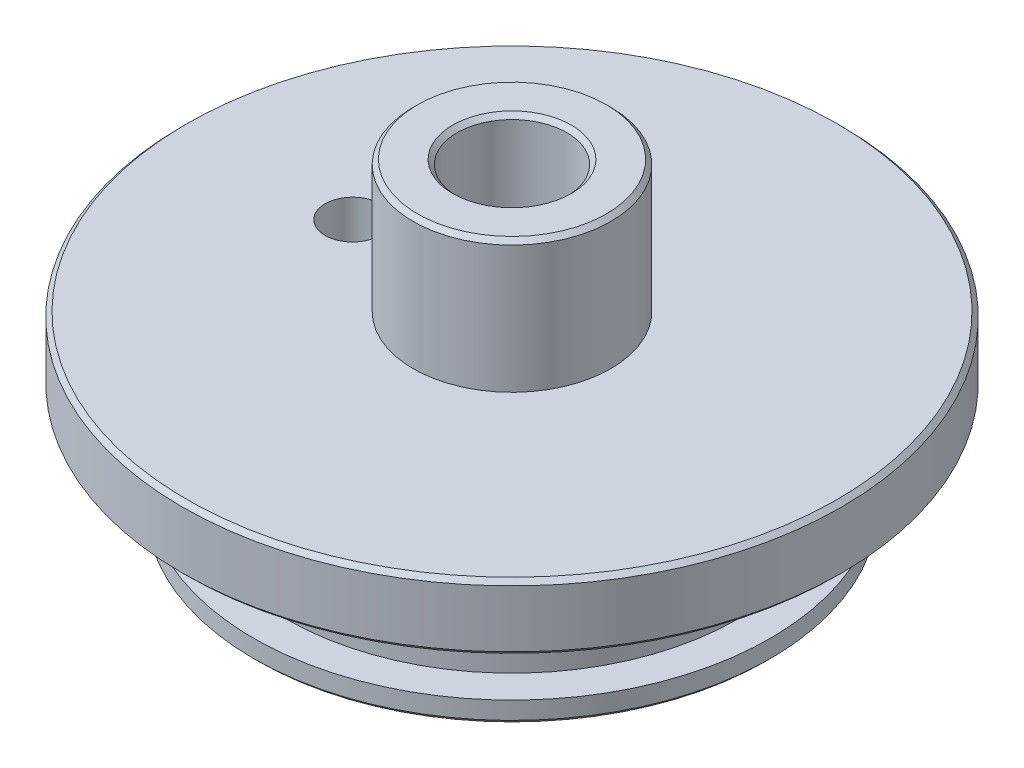
ISO-10303-21;
HEADER;
FILE_DESCRIPTION(('STEP AP214'),'2;1');
FILE_NAME('part.step','',(''),(''),'','','');
FILE_SCHEMA(('AUTOMOTIVE_DESIGN { 1 0 10303 214 1 1 1 1 }'));
ENDSEC;
DATA;
#1=APPLICATION_CONTEXT('core data for automotive mechanical design processes');
#2=APPLICATION_PROTOCOL_DEFINITION('international standard','automotive_design',2000,#1);
#3=PRODUCT_CONTEXT('',#1,'mechanical');
#4=PRODUCT('Part','Part','',(#3));
#5=PRODUCT_RELATED_PRODUCT_CATEGORY('part','',(#4));
#6=PRODUCT_DEFINITION_FORMATION('','',#4);
#7=PRODUCT_DEFINITION_CONTEXT('part definition',#1,'design');
#8=PRODUCT_DEFINITION('design','',#6,#7);
#9=PRODUCT_DEFINITION_SHAPE('','',#8);
#10=(LENGTH_UNIT() NAMED_UNIT(*) SI_UNIT(.MILLI.,.METRE.));
#11=(NAMED_UNIT(*) PLANE_ANGLE_UNIT() SI_UNIT($,.RADIAN.));
#12=(NAMED_UNIT(*) SI_UNIT($,.STERADIAN.) SOLID_ANGLE_UNIT());
#13=UNCERTAINTY_MEASURE_WITH_UNIT(LENGTH_MEASURE(1.E-05),#10,'distance_accuracy_value','');
#14=(GEOMETRIC_REPRESENTATION_CONTEXT(3) GLOBAL_UNCERTAINTY_ASSIGNED_CONTEXT((#13)) GLOBAL_UNIT_ASSIGNED_CONTEXT((#10,
#11,#12)) REPRESENTATION_CONTEXT('',''));
#15=CARTESIAN_POINT('',(0.,0.,0.));
#16=DIRECTION('',(0.,0.,1.));
#17=DIRECTION('',(1.,0.,0.));
#18=AXIS2_PLACEMENT_3D('',#15,#16,#17);
#19=CARTESIAN_POINT('',(-11.75,1.,0.));
#20=DIRECTION('',(0.,1.,0.));
#21=DIRECTION('',(0.,0.,1.));
#22=AXIS2_PLACEMENT_3D('',#19,#20,#21);
#23=PLANE('',#22);
#24=CARTESIAN_POINT('',(0.,1.,0.));
#25=DIRECTION('',(0.,-1.,0.));
#26=DIRECTION('',(0.,0.,-1.));
#27=AXIS2_PLACEMENT_3D('',#24,#25,#26);
#28=CIRCLE('',#27,11.75);
#29=CARTESIAN_POINT('',(0.,1.,-11.75));
#30=VERTEX_POINT('',#29);
#31=EDGE_CURVE('E183',#30,#30,#28,.T.);
#32=ORIENTED_EDGE('',*,*,#31,.F.);
#33=EDGE_LOOP('',(#32));
#34=FACE_BOUND('',#33,.T.);
#35=CARTESIAN_POINT('',(0.,1.,0.));
#36=DIRECTION('',(0.,-1.,0.));
#37=DIRECTION('',(0.,0.,-1.));
#38=AXIS2_PLACEMENT_3D('',#35,#36,#37);
#39=CIRCLE('',#38,10.25);
#40=CARTESIAN_POINT('',(0.,1.,-10.25));
#41=VERTEX_POINT('',#40);
#42=EDGE_CURVE('E188',#41,#41,#39,.F.);
#43=ORIENTED_EDGE('',*,*,#42,.F.);
#44=EDGE_LOOP('',(#43));
#45=FACE_BOUND('',#44,.T.);
#46=ADVANCED_FACE('F16',(#34,#45),#23,.T.);
#47=CARTESIAN_POINT('',(0.,0.,0.));
#48=DIRECTION('',(0.,-1.,0.));
#49=DIRECTION('',(0.,0.,-1.));
#50=AXIS2_PLACEMENT_3D('',#47,#48,#49);
#51=CYLINDRICAL_SURFACE('',#50,10.25);
#52=ORIENTED_EDGE('',*,*,#42,.T.);
#53=EDGE_LOOP('',(#52));
#54=FACE_BOUND('',#53,.T.);
#55=CARTESIAN_POINT('',(0.,3.5,0.));
#56=DIRECTION('',(0.,-1.,0.));
#57=DIRECTION('',(0.,0.,-1.));
#58=AXIS2_PLACEMENT_3D('',#55,#56,#57);
#59=CIRCLE('',#58,10.25);
#60=CARTESIAN_POINT('',(0.,3.5,-10.25));
#61=VERTEX_POINT('',#60);
#62=EDGE_CURVE('E120',#61,#61,#59,.F.);
#63=ORIENTED_EDGE('',*,*,#62,.F.);
#64=EDGE_LOOP('',(#63));
#65=FACE_BOUND('',#64,.T.);
#66=ADVANCED_FACE('F193',(#54,#65),#51,.T.);
#67=CARTESIAN_POINT('',(0.,5.,0.));
#68=DIRECTION('',(0.,-1.,0.));
#69=DIRECTION('',(0.,0.,-1.));
#70=AXIS2_PLACEMENT_3D('',#67,#68,#69);
#71=CYLINDRICAL_SURFACE('',#70,11.75);
#72=ORIENTED_EDGE('',*,*,#31,.T.);
#73=EDGE_LOOP('',(#72));
#74=FACE_BOUND('',#73,.T.);
#75=CARTESIAN_POINT('',(0.,0.200000000000007,0.));
#76=DIRECTION('',(0.,1.,0.));
#77=DIRECTION('',(0.,0.,1.));
#78=AXIS2_PLACEMENT_3D('',#75,#76,#77);
#79=CIRCLE('',#78,11.75);
#80=CARTESIAN_POINT('',(0.,0.200000000000007,11.75));
#81=VERTEX_POINT('',#80);
#82=EDGE_CURVE('E116',#81,#81,#79,.F.);
#83=ORIENTED_EDGE('',*,*,#82,.F.);
#84=EDGE_LOOP('',(#83));
#85=FACE_BOUND('',#84,.T.);
#86=ADVANCED_FACE('F202',(#74,#85),#71,.T.);
#87=CARTESIAN_POINT('',(-11.75,3.5,0.));
#88=DIRECTION('',(0.,-1.,0.));
#89=DIRECTION('',(0.,0.,-1.));
#90=AXIS2_PLACEMENT_3D('',#87,#88,#89);
#91=PLANE('',#90);
#92=ORIENTED_EDGE('',*,*,#62,.T.);
#93=EDGE_LOOP('',(#92));
#94=FACE_BOUND('',#93,.T.);
#95=CARTESIAN_POINT('',(0.,3.5,0.));
#96=DIRECTION('',(0.,-1.,0.));
#97=DIRECTION('',(0.,0.,-1.));
#98=AXIS2_PLACEMENT_3D('',#95,#96,#97);
#99=CIRCLE('',#98,11.75);
#100=CARTESIAN_POINT('',(0.,3.5,-11.75));
#101=VERTEX_POINT('',#100);
#102=EDGE_CURVE('E119',#101,#101,#99,.F.);
#103=ORIENTED_EDGE('',*,*,#102,.F.);
#104=EDGE_LOOP('',(#103));
#105=FACE_BOUND('',#104,.T.);
#106=ADVANCED_FACE('F207',(#94,#105),#91,.T.);
#107=CARTESIAN_POINT('',(0.,0.200000000000007,0.));
#108=DIRECTION('',(0.,1.,0.));
#109=DIRECTION('',(0.,0.,1.));
#110=AXIS2_PLACEMENT_3D('',#107,#108,#109);
#111=CONICAL_SURFACE('',#110,11.75,0.785398163397439);
#112=ORIENTED_EDGE('',*,*,#82,.T.);
#113=EDGE_LOOP('',(#112));
#114=FACE_BOUND('',#113,.T.);
#115=CARTESIAN_POINT('',(0.,0.,0.));
#116=DIRECTION('',(0.,1.,0.));
#117=DIRECTION('',(0.,0.,1.));
#118=AXIS2_PLACEMENT_3D('',#115,#116,#117);
#119=CIRCLE('',#118,11.55);
#120=CARTESIAN_POINT('',(0.,0.,11.55));
#121=VERTEX_POINT('',#120);
#122=EDGE_CURVE('E170',#121,#121,#119,.T.);
#123=ORIENTED_EDGE('',*,*,#122,.T.);
#124=EDGE_LOOP('',(#123));
#125=FACE_BOUND('',#124,.T.);
#126=ADVANCED_FACE('F211',(#114,#125),#111,.T.);
#127=CARTESIAN_POINT('',(0.,5.,0.));
#128=DIRECTION('',(0.,-1.,0.));
#129=DIRECTION('',(0.,0.,-1.));
#130=AXIS2_PLACEMENT_3D('',#127,#128,#129);
#131=CYLINDRICAL_SURFACE('',#130,11.75);
#132=ORIENTED_EDGE('',*,*,#102,.T.);
#133=EDGE_LOOP('',(#132));
#134=FACE_BOUND('',#133,.T.);
#135=CARTESIAN_POINT('',(0.,5.,0.));
#136=DIRECTION('',(0.,-1.,0.));
#137=DIRECTION('',(0.,0.,-1.));
#138=AXIS2_PLACEMENT_3D('',#135,#136,#137);
#139=CIRCLE('',#138,11.75);
#140=CARTESIAN_POINT('',(0.,5.,-11.75));
#141=VERTEX_POINT('',#140);
#142=EDGE_CURVE('E127',#141,#141,#139,.T.);
#143=ORIENTED_EDGE('',*,*,#142,.T.);
#144=EDGE_LOOP('',(#143));
#145=FACE_BOUND('',#144,.T.);
#146=ADVANCED_FACE('F214',(#134,#145),#131,.T.);
#147=CARTESIAN_POINT('',(0.,0.,0.));
#148=DIRECTION('',(0.,1.,0.));
#149=DIRECTION('',(0.,0.,1.));
#150=AXIS2_PLACEMENT_3D('',#147,#148,#149);
#151=PLANE('',#150);
#152=ORIENTED_EDGE('',*,*,#122,.F.);
#153=EDGE_LOOP('',(#152));
#154=FACE_BOUND('',#153,.T.);
#155=CARTESIAN_POINT('',(0.,0.,0.));
#156=DIRECTION('',(0.,-1.,0.));
#157=DIRECTION('',(0.,0.,-1.));
#158=AXIS2_PLACEMENT_3D('',#155,#156,#157);
#159=CIRCLE('',#158,9.5);
#160=CARTESIAN_POINT('',(0.,0.,-9.5));
#161=VERTEX_POINT('',#160);
#162=EDGE_CURVE('E126',#161,#161,#159,.F.);
#163=ORIENTED_EDGE('',*,*,#162,.T.);
#164=EDGE_LOOP('',(#163));
#165=FACE_BOUND('',#164,.T.);
#166=ADVANCED_FACE('F218',(#154,#165),#151,.F.);
#167=CARTESIAN_POINT('',(0.,5.,0.));
#168=DIRECTION('',(0.,1.,0.));
#169=DIRECTION('',(0.,0.,1.));
#170=AXIS2_PLACEMENT_3D('',#167,#168,#169);
#171=PLANE('',#170);
#172=ORIENTED_EDGE('',*,*,#142,.F.);
#173=EDGE_LOOP('',(#172));
#174=FACE_BOUND('',#173,.T.);
#175=CARTESIAN_POINT('',(0.,5.,0.));
#176=DIRECTION('',(0.,1.,0.));
#177=DIRECTION('',(0.,0.,1.));
#178=AXIS2_PLACEMENT_3D('',#175,#176,#177);
#179=CIRCLE('',#178,14.8);
#180=CARTESIAN_POINT('',(0.,5.,14.8));
#181=VERTEX_POINT('',#180);
#182=EDGE_CURVE('E154',#181,#181,#179,.T.);
#183=ORIENTED_EDGE('',*,*,#182,.F.);
#184=EDGE_LOOP('',(#183));
#185=FACE_BOUND('',#184,.T.);
#186=ADVANCED_FACE('F221',(#174,#185),#171,.F.);
#187=CARTESIAN_POINT('',(0.,13.9999999999532,0.));
#188=DIRECTION('',(0.,1.,0.));
#189=DIRECTION('',(0.,0.,1.));
#190=AXIS2_PLACEMENT_3D('',#187,#188,#189);
#191=CONICAL_SURFACE('',#190,2.69999999989068,0.785398163397448);
#192=CARTESIAN_POINT('',(0.,13.8,0.));
#193=DIRECTION('',(0.,1.,0.));
#194=DIRECTION('',(0.,0.,1.));
#195=AXIS2_PLACEMENT_3D('',#192,#193,#194);
#196=CIRCLE('',#195,2.5);
#197=CARTESIAN_POINT('',(0.,13.8,2.5));
#198=VERTEX_POINT('',#197);
#199=EDGE_CURVE('E123',#198,#198,#196,.F.);
#200=ORIENTED_EDGE('',*,*,#199,.T.);
#201=EDGE_LOOP('',(#200));
#202=FACE_BOUND('',#201,.T.);
#203=CARTESIAN_POINT('',(0.,14.0000000000668,0.));
#204=DIRECTION('',(0.,1.,0.));
#205=DIRECTION('',(0.,0.,1.));
#206=AXIS2_PLACEMENT_3D('',#203,#204,#205);
#207=CIRCLE('',#206,2.70000000000437);
#208=CARTESIAN_POINT('',(0.,14.0000000000668,2.70000000000437));
#209=VERTEX_POINT('',#208);
#210=EDGE_CURVE('E132',#209,#209,#207,.F.);
#211=ORIENTED_EDGE('',*,*,#210,.F.);
#212=EDGE_LOOP('',(#211));
#213=FACE_BOUND('',#212,.T.);
#214=ADVANCED_FACE('F237',(#202,#213),#191,.F.);
#215=CARTESIAN_POINT('',(0.,0.,0.));
#216=DIRECTION('',(0.,1.,0.));
#217=DIRECTION('',(0.,0.,1.));
#218=AXIS2_PLACEMENT_3D('',#215,#216,#217);
#219=CYLINDRICAL_SURFACE('',#218,2.5);
#220=ORIENTED_EDGE('',*,*,#199,.F.);
#221=EDGE_LOOP('',(#220));
#222=FACE_BOUND('',#221,.T.);
#223=CARTESIAN_POINT('',(0.,6.3397459621556,0.));
#224=DIRECTION('',(0.,-1.,0.));
#225=DIRECTION('',(0.,0.,-1.));
#226=AXIS2_PLACEMENT_3D('',#223,#224,#225);
#227=CIRCLE('',#226,2.5);
#228=CARTESIAN_POINT('',(0.,6.3397459621556,-2.5));
#229=VERTEX_POINT('',#228);
#230=EDGE_CURVE('E39',#229,#229,#227,.T.);
#231=ORIENTED_EDGE('',*,*,#230,.T.);
#232=EDGE_LOOP('',(#231));
#233=FACE_BOUND('',#232,.T.);
#234=ADVANCED_FACE('F227',(#222,#233),#219,.F.);
#235=CARTESIAN_POINT('',(0.,5.,0.));
#236=DIRECTION('',(0.,-1.,0.));
#237=DIRECTION('',(0.,0.,-1.));
#238=AXIS2_PLACEMENT_3D('',#235,#236,#237);
#239=CYLINDRICAL_SURFACE('',#238,9.5);
#240=ORIENTED_EDGE('',*,*,#162,.F.);
#241=EDGE_LOOP('',(#240));
#242=FACE_BOUND('',#241,.T.);
#243=CARTESIAN_POINT('',(0.,5.,0.));
#244=DIRECTION('',(0.,-1.,0.));
#245=DIRECTION('',(0.,0.,-1.));
#246=AXIS2_PLACEMENT_3D('',#243,#244,#245);
#247=CIRCLE('',#246,9.5);
#248=CARTESIAN_POINT('',(0.,5.,-9.5));
#249=VERTEX_POINT('',#248);
#250=EDGE_CURVE('E38',#249,#249,#247,.T.);
#251=ORIENTED_EDGE('',*,*,#250,.F.);
#252=EDGE_LOOP('',(#251));
#253=FACE_BOUND('',#252,.T.);
#254=ADVANCED_FACE('F150',(#242,#253),#239,.F.);
#255=CARTESIAN_POINT('',(0.,5.19999999999999,0.));
#256=DIRECTION('',(0.,1.,0.));
#257=DIRECTION('',(0.,0.,1.));
#258=AXIS2_PLACEMENT_3D('',#255,#256,#257);
#259=CONICAL_SURFACE('',#258,15.,0.785398163397459);
#260=CARTESIAN_POINT('',(0.,5.19999999999999,0.));
#261=DIRECTION('',(0.,-1.,0.));
#262=DIRECTION('',(0.,0.,-1.));
#263=AXIS2_PLACEMENT_3D('',#260,#261,#262);
#264=CIRCLE('',#263,15.);
#265=CARTESIAN_POINT('',(0.,5.19999999999999,-15.));
#266=VERTEX_POINT('',#265);
#267=EDGE_CURVE('E50',#266,#266,#264,.F.);
#268=ORIENTED_EDGE('',*,*,#267,.F.);
#269=EDGE_LOOP('',(#268));
#270=FACE_BOUND('',#269,.T.);
#271=ORIENTED_EDGE('',*,*,#182,.T.);
#272=EDGE_LOOP('',(#271));
#273=FACE_BOUND('',#272,.T.);
#274=ADVANCED_FACE('F147',(#270,#273),#259,.T.);
#275=CARTESIAN_POINT('',(0.,14.,0.));
#276=DIRECTION('',(0.,1.,0.));
#277=DIRECTION('',(0.,0.,1.));
#278=AXIS2_PLACEMENT_3D('',#275,#276,#277);
#279=PLANE('',#278);
#280=ORIENTED_EDGE('',*,*,#210,.T.);
#281=EDGE_LOOP('',(#280));
#282=FACE_BOUND('',#281,.T.);
#283=CARTESIAN_POINT('',(0.,14.00000000001,0.));
#284=DIRECTION('',(0.,-1.,0.));
#285=DIRECTION('',(0.,0.,-1.));
#286=AXIS2_PLACEMENT_3D('',#283,#284,#285);
#287=CIRCLE('',#286,4.30000000000064);
#288=CARTESIAN_POINT('',(0.,14.00000000001,-4.30000000000064));
#289=VERTEX_POINT('',#288);
#290=EDGE_CURVE('E47',#289,#289,#287,.T.);
#291=ORIENTED_EDGE('',*,*,#290,.F.);
#292=EDGE_LOOP('',(#291));
#293=FACE_BOUND('',#292,.T.);
#294=ADVANCED_FACE('F83',(#282,#293),#279,.T.);
#295=CARTESIAN_POINT('',(0.,5.,0.));
#296=DIRECTION('',(0.,-1.,0.));
#297=DIRECTION('',(1.,0.,0.));
#298=AXIS2_PLACEMENT_3D('',#295,#296,#297);
#299=CONICAL_SURFACE('',#298,7.5,1.30899693899575);
#300=ORIENTED_EDGE('',*,*,#230,.F.);
#301=EDGE_LOOP('',(#300));
#302=FACE_BOUND('',#301,.T.);
#303=CARTESIAN_POINT('',(-7.39655172413793,5.,1.24137931034483));
#304=CARTESIAN_POINT('',(-7.36038276954811,5.00936810909791,1.24564852419471));
#305=CARTESIAN_POINT('',(-7.32407285632753,5.01883890076255,1.24833220468083));
#306=CARTESIAN_POINT('',(-7.25139988111278,5.03793221499266,1.25052830876972));
#307=CARTESIAN_POINT('',(-7.21503682330282,5.04755472614124,1.25004096986612));
#308=CARTESIAN_POINT('',(-7.10629291812328,5.07654752003307,1.24382788780102));
#309=CARTESIAN_POINT('',(-7.03416642796558,5.09606658258339,1.23336166777408));
#310=CARTESIAN_POINT('',(-6.89278421359316,5.13491960240743,1.20007508674808));
#311=CARTESIAN_POINT('',(-6.82352945237804,5.15425349594203,1.17725061705649));
#312=CARTESIAN_POINT('',(-6.68985224192523,5.19214401428698,1.11983107945109));
#313=CARTESIAN_POINT('',(-6.62542891659918,5.21070077974383,1.08523815185074));
#314=CARTESIAN_POINT('',(-6.50353859551733,5.24632357625435,1.00528091761095));
#315=CARTESIAN_POINT('',(-6.44604725468874,5.26339476213553,0.95995606923176));
#316=CARTESIAN_POINT('',(-6.33954472078275,5.29543550976791,0.859605725665799));
#317=CARTESIAN_POINT('',(-6.29053349537923,5.3104050795304,0.804580267459266));
#318=CARTESIAN_POINT('',(-6.20394965279538,5.33714162313278,0.688037126778036));
#319=CARTESIAN_POINT('',(-6.1660866050745,5.34898886365808,0.626753915626478));
#320=CARTESIAN_POINT('',(-6.10129886381759,5.36942188183618,0.498160462732466));
#321=CARTESIAN_POINT('',(-6.07437024604013,5.37800882949869,0.430852393845323));
#322=CARTESIAN_POINT('',(-6.03342124475248,5.39112625438501,0.295335359920661));
#323=CARTESIAN_POINT('',(-6.0188804507906,5.39582002708242,0.227299325739792));
#324=CARTESIAN_POINT('',(-6.00128712273232,5.40150447252068,0.0896093958011533));
#325=CARTESIAN_POINT('',(-5.99823215815526,5.40249592869691,0.0199558454601449));
#326=CARTESIAN_POINT('',(-6.00363440829163,5.40074736035604,-0.11657021090316));
#327=CARTESIAN_POINT('',(-6.0117197332033,5.39812787639145,-0.183459378931302));
#328=CARTESIAN_POINT('',(-6.03844839951275,5.38951748833236,-0.314861624090907));
#329=CARTESIAN_POINT('',(-6.05709143382355,5.3835266822979,-0.379374770274441));
#330=CARTESIAN_POINT('',(-6.10435400095187,5.36846750376658,-0.50445925747087));
#331=CARTESIAN_POINT('',(-6.13300238711627,5.35939023256996,-0.565018590448487));
#332=CARTESIAN_POINT('',(-6.19933449194077,5.33859855801432,-0.680467898794888));
#333=CARTESIAN_POINT('',(-6.23701994414326,5.32688364871464,-0.735356783531475));
#334=CARTESIAN_POINT('',(-6.32176244321201,5.30086793490045,-0.839977933757636));
#335=CARTESIAN_POINT('',(-6.36910061073878,5.28649116377839,-0.889463440331742));
#336=CARTESIAN_POINT('',(-6.47087459566634,5.25601657384435,-0.979845973642245));
#337=CARTESIAN_POINT('',(-6.52531113680776,5.23991857956895,-1.02074212350785));
#338=CARTESIAN_POINT('',(-6.64229080923945,5.20583267519791,-1.09461214737452));
#339=CARTESIAN_POINT('',(-6.70508166176211,5.18779329478578,-1.12717044367693));
#340=CARTESIAN_POINT('',(-6.83507193773677,5.15102363978859,-1.18122616232362));
#341=CARTESIAN_POINT('',(-6.90227273485687,5.13229315073077,-1.20272011958453));
#342=CARTESIAN_POINT('',(-7.04035536642951,5.09438713545609,-1.23435547525774));
#343=CARTESIAN_POINT('',(-7.11127730804985,5.07520914887048,-1.24432166418827));
#344=CARTESIAN_POINT('',(-7.21816967214166,5.04672461058274,-1.25010657797434));
#345=CARTESIAN_POINT('',(-7.25390710260036,5.03727121524351,-1.25050495458752));
#346=CARTESIAN_POINT('',(-7.32532567847133,5.01851215279912,-1.24823916321219));
#347=CARTESIAN_POINT('',(-7.36100682059002,5.00920649406928,-1.24557482221951));
#348=CARTESIAN_POINT('',(-7.39655172413793,5.,-1.24137931034483));
#349=B_SPLINE_CURVE_WITH_KNOTS('',3,(#303,#304,#305,#306,#307,#308,#309,#310,#311,#312,#313,
#314,#315,#316,#317,#318,#319,#320,#321,#322,#323,#324,#325,#326,#327,#328,#329,#330,#331,#332,
#333,#334,#335,#336,#337,#338,#339,#340,#341,#342,#343,#344,#345,#346,#347,#348),.UNSPECIFIED.,
.F.,.F.,(4,2,2,2,2,2,2,2,2,2,2,2,2,2,2,2,2,2,2,2,2,2,4),(0.,0.112745981342181,0.225483518666975,
0.450678701647596,0.67594880028681,0.901177951241936,1.12559151624363,1.3500042257642,
1.56791081125799,1.78573912331083,1.99388817653894,2.20199318151294,2.40331691664623,
2.60463479627424,2.80653809490028,3.00848015481266,3.21746859262963,3.4264783553122,
3.64446279739313,3.86251546545917,4.08384046765263,4.19463685601411,4.30543950325509),.UNSPECIFIED.);
#350=CARTESIAN_POINT('',(-7.39655172413793,5.,1.24137931034483));
#351=VERTEX_POINT('',#350);
#352=CARTESIAN_POINT('',(-7.39655172413793,5.,-1.24137931034483));
#353=VERTEX_POINT('',#352);
#354=EDGE_CURVE('E31',#351,#353,#349,.T.);
#355=ORIENTED_EDGE('',*,*,#354,.T.);
#356=CARTESIAN_POINT('',(0.,5.,0.));
#357=DIRECTION('',(0.,-1.,0.));
#358=DIRECTION('',(1.,0.,0.));
#359=AXIS2_PLACEMENT_3D('',#356,#357,#358);
#360=CIRCLE('',#359,7.5);
#361=EDGE_CURVE('E33',#351,#353,#360,.F.);
#362=ORIENTED_EDGE('',*,*,#361,.F.);
#363=EDGE_LOOP('',(#355,#362));
#364=FACE_BOUND('',#363,.T.);
#365=ADVANCED_FACE('F35',(#302,#364),#299,.F.);
#366=CARTESIAN_POINT('',(0.,5.,0.));
#367=DIRECTION('',(0.,-1.,0.));
#368=DIRECTION('',(0.,0.,-1.));
#369=AXIS2_PLACEMENT_3D('',#366,#367,#368);
#370=PLANE('',#369);
#371=ORIENTED_EDGE('',*,*,#250,.T.);
#372=EDGE_LOOP('',(#371));
#373=FACE_BOUND('',#372,.T.);
#374=CARTESIAN_POINT('',(-7.25,5.,0.));
#375=DIRECTION('',(0.,1.,0.));
#376=DIRECTION('',(0.,0.,1.));
#377=AXIS2_PLACEMENT_3D('',#374,#375,#376);
#378=CIRCLE('',#377,1.25);
#379=EDGE_CURVE('E41',#353,#351,#378,.T.);
#380=ORIENTED_EDGE('',*,*,#379,.T.);
#381=ORIENTED_EDGE('',*,*,#361,.T.);
#382=EDGE_LOOP('',(#380,#381));
#383=FACE_BOUND('',#382,.T.);
#384=ADVANCED_FACE('F42',(#373,#383),#370,.T.);
#385=CARTESIAN_POINT('',(0.,8.,0.));
#386=DIRECTION('',(0.,-1.,0.));
#387=DIRECTION('',(0.,0.,-1.));
#388=AXIS2_PLACEMENT_3D('',#385,#386,#387);
#389=CYLINDRICAL_SURFACE('',#388,15.);
#390=CARTESIAN_POINT('',(0.,7.80000000000001,0.));
#391=DIRECTION('',(0.,-1.,0.));
#392=DIRECTION('',(0.,0.,-1.));
#393=AXIS2_PLACEMENT_3D('',#390,#391,#392);
#394=CIRCLE('',#393,15.);
#395=CARTESIAN_POINT('',(0.,7.80000000000001,-15.));
#396=VERTEX_POINT('',#395);
#397=EDGE_CURVE('E44',#396,#396,#394,.F.);
#398=ORIENTED_EDGE('',*,*,#397,.F.);
#399=EDGE_LOOP('',(#398));
#400=FACE_BOUND('',#399,.T.);
#401=ORIENTED_EDGE('',*,*,#267,.T.);
#402=EDGE_LOOP('',(#401));
#403=FACE_BOUND('',#402,.T.);
#404=ADVANCED_FACE('F73',(#400,#403),#389,.T.);
#405=CARTESIAN_POINT('',(0.,13.8000000001171,0.));
#406=DIRECTION('',(0.,-1.,0.));
#407=DIRECTION('',(0.,0.,-1.));
#408=AXIS2_PLACEMENT_3D('',#405,#406,#407);
#409=CONICAL_SURFACE('',#408,4.49999999989359,0.785398163397448);
#410=ORIENTED_EDGE('',*,*,#290,.T.);
#411=EDGE_LOOP('',(#410));
#412=FACE_BOUND('',#411,.T.);
#413=CARTESIAN_POINT('',(0.,13.8,0.));
#414=DIRECTION('',(0.,-1.,0.));
#415=DIRECTION('',(0.,0.,-1.));
#416=AXIS2_PLACEMENT_3D('',#413,#414,#415);
#417=CIRCLE('',#416,4.5);
#418=CARTESIAN_POINT('',(0.,13.8,-4.5));
#419=VERTEX_POINT('',#418);
#420=EDGE_CURVE('E103',#419,#419,#417,.T.);
#421=ORIENTED_EDGE('',*,*,#420,.F.);
#422=EDGE_LOOP('',(#421));
#423=FACE_BOUND('',#422,.T.);
#424=ADVANCED_FACE('F68',(#412,#423),#409,.T.);
#425=CARTESIAN_POINT('',(-7.25,0.,0.));
#426=DIRECTION('',(0.,1.,0.));
#427=DIRECTION('',(0.,0.,1.));
#428=AXIS2_PLACEMENT_3D('',#425,#426,#427);
#429=CYLINDRICAL_SURFACE('',#428,1.25);
#430=CARTESIAN_POINT('',(-7.25,8.,0.));
#431=DIRECTION('',(0.,1.,0.));
#432=DIRECTION('',(0.,0.,1.));
#433=AXIS2_PLACEMENT_3D('',#430,#431,#432);
#434=CIRCLE('',#433,1.25);
#435=CARTESIAN_POINT('',(-7.25,8.,1.25));
#436=VERTEX_POINT('',#435);
#437=EDGE_CURVE('E102',#436,#436,#434,.F.);
#438=ORIENTED_EDGE('',*,*,#437,.F.);
#439=EDGE_LOOP('',(#438));
#440=FACE_BOUND('',#439,.T.);
#441=ORIENTED_EDGE('',*,*,#354,.F.);
#442=ORIENTED_EDGE('',*,*,#379,.F.);
#443=EDGE_LOOP('',(#441,#442));
#444=FACE_BOUND('',#443,.T.);
#445=ADVANCED_FACE('F46',(#440,#444),#429,.F.);
#446=CARTESIAN_POINT('',(0.,7.80000000000001,0.));
#447=DIRECTION('',(0.,-1.,0.));
#448=DIRECTION('',(0.,0.,-1.));
#449=AXIS2_PLACEMENT_3D('',#446,#447,#448);
#450=CONICAL_SURFACE('',#449,15.,0.785398163397459);
#451=CARTESIAN_POINT('',(0.,8.,0.));
#452=DIRECTION('',(0.,-1.,0.));
#453=DIRECTION('',(0.,0.,-1.));
#454=AXIS2_PLACEMENT_3D('',#451,#452,#453);
#455=CIRCLE('',#454,14.8);
#456=CARTESIAN_POINT('',(0.,8.,-14.8));
#457=VERTEX_POINT('',#456);
#458=EDGE_CURVE('E24',#457,#457,#455,.F.);
#459=ORIENTED_EDGE('',*,*,#458,.F.);
#460=EDGE_LOOP('',(#459));
#461=FACE_BOUND('',#460,.T.);
#462=ORIENTED_EDGE('',*,*,#397,.T.);
#463=EDGE_LOOP('',(#462));
#464=FACE_BOUND('',#463,.T.);
#465=ADVANCED_FACE('F67',(#461,#464),#450,.T.);
#466=CARTESIAN_POINT('',(0.,14.,0.));
#467=DIRECTION('',(0.,-1.,0.));
#468=DIRECTION('',(0.,0.,-1.));
#469=AXIS2_PLACEMENT_3D('',#466,#467,#468);
#470=CYLINDRICAL_SURFACE('',#469,4.5);
#471=CARTESIAN_POINT('',(0.,8.,0.));
#472=DIRECTION('',(0.,-1.,0.));
#473=DIRECTION('',(0.,0.,-1.));
#474=AXIS2_PLACEMENT_3D('',#471,#472,#473);
#475=CIRCLE('',#474,4.5);
#476=CARTESIAN_POINT('',(0.,8.,-4.5));
#477=VERTEX_POINT('',#476);
#478=EDGE_CURVE('E11',#477,#477,#475,.T.);
#479=ORIENTED_EDGE('',*,*,#478,.F.);
#480=EDGE_LOOP('',(#479));
#481=FACE_BOUND('',#480,.T.);
#482=ORIENTED_EDGE('',*,*,#420,.T.);
#483=EDGE_LOOP('',(#482));
#484=FACE_BOUND('',#483,.T.);
#485=ADVANCED_FACE('F88',(#481,#484),#470,.T.);
#486=CARTESIAN_POINT('',(0.,8.,0.));
#487=DIRECTION('',(0.,1.,0.));
#488=DIRECTION('',(0.,0.,1.));
#489=AXIS2_PLACEMENT_3D('',#486,#487,#488);
#490=PLANE('',#489);
#491=ORIENTED_EDGE('',*,*,#478,.T.);
#492=EDGE_LOOP('',(#491));
#493=FACE_BOUND('',#492,.T.);
#494=ORIENTED_EDGE('',*,*,#458,.T.);
#495=EDGE_LOOP('',(#494));
#496=FACE_BOUND('',#495,.T.);
#497=ORIENTED_EDGE('',*,*,#437,.T.);
#498=EDGE_LOOP('',(#497));
#499=FACE_BOUND('',#498,.T.);
#500=ADVANCED_FACE('F86',(#493,#496,#499),#490,.T.);
#501=CLOSED_SHELL('',(#46,#66,#86,#106,#126,#146,#166,#186,#214,#234,#254,#274,#294,#365,#384,
#404,#424,#445,#465,#485,#500));
#502=MANIFOLD_SOLID_BREP('B1',#501);
#503=ADVANCED_BREP_SHAPE_REPRESENTATION('',(#18,#502),#14);
#504=SHAPE_DEFINITION_REPRESENTATION(#9,#503);
ENDSEC;
END-ISO-10303-21;
